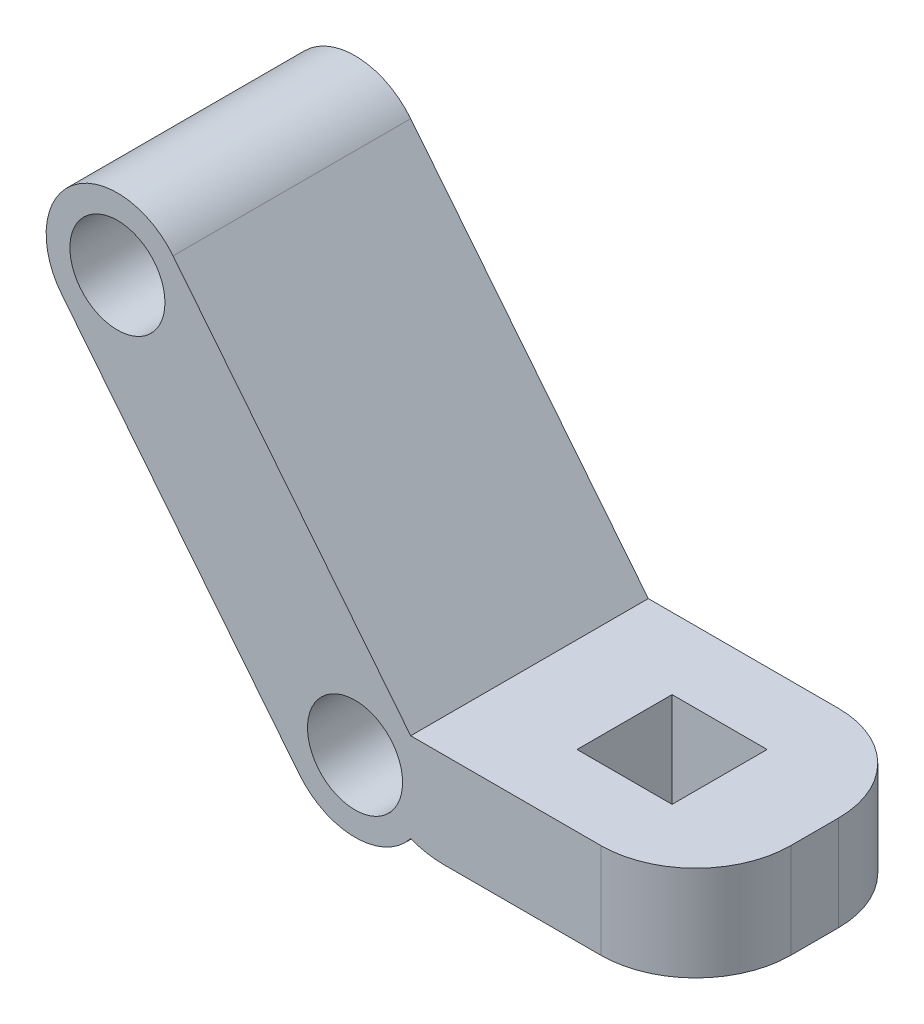
ISO-10303-21;
HEADER;
FILE_DESCRIPTION(('STEP AP214'),'2;1');
FILE_NAME('part.step','',(''),(''),'','','');
FILE_SCHEMA(('AUTOMOTIVE_DESIGN { 1 0 10303 214 1 1 1 1 }'));
ENDSEC;
DATA;
#1=APPLICATION_CONTEXT('core data for automotive mechanical design processes');
#2=APPLICATION_PROTOCOL_DEFINITION('international standard','automotive_design',2000,#1);
#3=PRODUCT_CONTEXT('',#1,'mechanical');
#4=PRODUCT('Part','Part','',(#3));
#5=PRODUCT_RELATED_PRODUCT_CATEGORY('part','',(#4));
#6=PRODUCT_DEFINITION_FORMATION('','',#4);
#7=PRODUCT_DEFINITION_CONTEXT('part definition',#1,'design');
#8=PRODUCT_DEFINITION('design','',#6,#7);
#9=PRODUCT_DEFINITION_SHAPE('','',#8);
#10=(LENGTH_UNIT() NAMED_UNIT(*) SI_UNIT(.MILLI.,.METRE.));
#11=(NAMED_UNIT(*) PLANE_ANGLE_UNIT() SI_UNIT($,.RADIAN.));
#12=(NAMED_UNIT(*) SI_UNIT($,.STERADIAN.) SOLID_ANGLE_UNIT());
#13=UNCERTAINTY_MEASURE_WITH_UNIT(LENGTH_MEASURE(1.E-05),#10,'distance_accuracy_value','');
#14=(GEOMETRIC_REPRESENTATION_CONTEXT(3) GLOBAL_UNCERTAINTY_ASSIGNED_CONTEXT((#13)) GLOBAL_UNIT_ASSIGNED_CONTEXT((#10,
#11,#12)) REPRESENTATION_CONTEXT('',''));
#15=CARTESIAN_POINT('',(0.,0.,0.));
#16=DIRECTION('',(0.,0.,1.));
#17=DIRECTION('',(1.,0.,0.));
#18=AXIS2_PLACEMENT_3D('',#15,#16,#17);
#19=CARTESIAN_POINT('',(-30.8546856234985,26.537489991992,25.));
#20=DIRECTION('',(0.,0.,-1.));
#21=DIRECTION('',(-1.,0.,0.));
#22=AXIS2_PLACEMENT_3D('',#19,#20,#21);
#23=CYLINDRICAL_SURFACE('',#22,7.49999999999999);
#24=CARTESIAN_POINT('',(-30.8546856234985,26.537489991992,0.));
#25=DIRECTION('',(0.,0.,1.));
#26=DIRECTION('',(1.,0.,0.));
#27=AXIS2_PLACEMENT_3D('',#24,#25,#26);
#28=CIRCLE('',#27,7.49999999999999);
#29=CARTESIAN_POINT('',(-25.,31.224989991992,0.));
#30=VERTEX_POINT('',#29);
#31=CARTESIAN_POINT('',(-36.709371246997,21.849989991992,0.));
#32=VERTEX_POINT('',#31);
#33=EDGE_CURVE('E224',#30,#32,#28,.T.);
#34=ORIENTED_EDGE('',*,*,#33,.T.);
#35=DIRECTION('',(0.,0.,-1.));
#36=VECTOR('',#35,1.);
#37=CARTESIAN_POINT('',(-36.709371246997,21.849989991992,25.));
#38=LINE('',#37,#36);
#39=CARTESIAN_POINT('',(-36.709371246997,21.849989991992,25.));
#40=VERTEX_POINT('',#39);
#41=EDGE_CURVE('E274',#40,#32,#38,.T.);
#42=ORIENTED_EDGE('',*,*,#41,.F.);
#43=CARTESIAN_POINT('',(-30.8546856234985,26.537489991992,25.));
#44=DIRECTION('',(0.,0.,1.));
#45=DIRECTION('',(1.,0.,0.));
#46=AXIS2_PLACEMENT_3D('',#43,#44,#45);
#47=CIRCLE('',#46,7.49999999999999);
#48=CARTESIAN_POINT('',(-25.,31.224989991992,25.));
#49=VERTEX_POINT('',#48);
#50=EDGE_CURVE('E236',#49,#40,#47,.T.);
#51=ORIENTED_EDGE('',*,*,#50,.F.);
#52=DIRECTION('',(0.,0.,-1.));
#53=VECTOR('',#52,1.);
#54=CARTESIAN_POINT('',(-25.,31.224989991992,25.));
#55=LINE('',#54,#53);
#56=EDGE_CURVE('E250',#49,#30,#55,.T.);
#57=ORIENTED_EDGE('',*,*,#56,.T.);
#58=EDGE_LOOP('',(#34,#42,#51,#57));
#59=FACE_BOUND('',#58,.T.);
#60=ADVANCED_FACE('F39',(#59),#23,.T.);
#61=CARTESIAN_POINT('',(-36.709371246997,21.849989991992,25.));
#62=DIRECTION('',(0.7806247497998,0.625,0.));
#63=DIRECTION('',(-0.625,0.7806247497998,0.));
#64=AXIS2_PLACEMENT_3D('',#61,#62,#63);
#65=PLANE('',#64);
#66=DIRECTION('',(0.625,-0.7806247497998,0.));
#67=VECTOR('',#66,1.);
#68=CARTESIAN_POINT('',(-36.709371246997,21.849989991992,0.));
#69=LINE('',#68,#67);
#70=CARTESIAN_POINT('',(-11.709371246997,-9.37499999999999,0.));
#71=VERTEX_POINT('',#70);
#72=EDGE_CURVE('E254',#32,#71,#69,.T.);
#73=ORIENTED_EDGE('',*,*,#72,.T.);
#74=DIRECTION('',(0.,0.,-1.));
#75=VECTOR('',#74,1.);
#76=CARTESIAN_POINT('',(-11.709371246997,-9.37499999999999,25.));
#77=LINE('',#76,#75);
#78=CARTESIAN_POINT('',(-11.709371246997,-9.37499999999999,25.));
#79=VERTEX_POINT('',#78);
#80=EDGE_CURVE('E270',#79,#71,#77,.T.);
#81=ORIENTED_EDGE('',*,*,#80,.F.);
#82=DIRECTION('',(0.625,-0.7806247497998,0.));
#83=VECTOR('',#82,1.);
#84=CARTESIAN_POINT('',(-36.709371246997,21.849989991992,25.));
#85=LINE('',#84,#83);
#86=EDGE_CURVE('E240',#40,#79,#85,.T.);
#87=ORIENTED_EDGE('',*,*,#86,.F.);
#88=ORIENTED_EDGE('',*,*,#41,.T.);
#89=EDGE_LOOP('',(#73,#81,#87,#88));
#90=FACE_BOUND('',#89,.T.);
#91=ADVANCED_FACE('F328',(#90),#65,.F.);
#92=CARTESIAN_POINT('',(-5.85468562349849,-4.68749999999999,25.));
#93=DIRECTION('',(0.,0.,-1.));
#94=DIRECTION('',(-1.,0.,0.));
#95=AXIS2_PLACEMENT_3D('',#92,#93,#94);
#96=CYLINDRICAL_SURFACE('',#95,7.49999999999999);
#97=CARTESIAN_POINT('',(-5.85468562349849,-4.68749999999999,0.));
#98=DIRECTION('',(0.,0.,1.));
#99=DIRECTION('',(1.,0.,0.));
#100=AXIS2_PLACEMENT_3D('',#97,#98,#99);
#101=CIRCLE('',#100,7.49999999999999);
#102=CARTESIAN_POINT('',(0.,-9.37499999999999,0.));
#103=VERTEX_POINT('',#102);
#104=EDGE_CURVE('E257',#71,#103,#101,.T.);
#105=ORIENTED_EDGE('',*,*,#104,.T.);
#106=DIRECTION('',(0.,0.,-1.));
#107=VECTOR('',#106,1.);
#108=CARTESIAN_POINT('',(0.,-9.37499999999999,25.));
#109=LINE('',#108,#107);
#110=CARTESIAN_POINT('',(0.,-9.37499999999999,25.));
#111=VERTEX_POINT('',#110);
#112=EDGE_CURVE('E206',#103,#111,#109,.F.);
#113=ORIENTED_EDGE('',*,*,#112,.T.);
#114=CARTESIAN_POINT('',(-5.85468562349849,-4.68749999999999,25.));
#115=DIRECTION('',(0.,0.,1.));
#116=DIRECTION('',(1.,0.,0.));
#117=AXIS2_PLACEMENT_3D('',#114,#115,#116);
#118=CIRCLE('',#117,7.49999999999999);
#119=EDGE_CURVE('E244',#79,#111,#118,.T.);
#120=ORIENTED_EDGE('',*,*,#119,.F.);
#121=ORIENTED_EDGE('',*,*,#80,.T.);
#122=EDGE_LOOP('',(#105,#113,#120,#121));
#123=FACE_BOUND('',#122,.T.);
#124=ADVANCED_FACE('F332',(#123),#96,.T.);
#125=CARTESIAN_POINT('',(-25.,31.224989991992,25.));
#126=DIRECTION('',(-0.7806247497998,-0.625,0.));
#127=DIRECTION('',(0.625,-0.7806247497998,0.));
#128=AXIS2_PLACEMENT_3D('',#125,#126,#127);
#129=PLANE('',#128);
#130=DIRECTION('',(-0.625,0.7806247497998,0.));
#131=VECTOR('',#130,1.);
#132=CARTESIAN_POINT('',(-25.,31.224989991992,0.));
#133=LINE('',#132,#131);
#134=CARTESIAN_POINT('',(0.,0.,0.));
#135=VERTEX_POINT('',#134);
#136=EDGE_CURVE('E241',#135,#30,#133,.T.);
#137=ORIENTED_EDGE('',*,*,#136,.T.);
#138=ORIENTED_EDGE('',*,*,#56,.F.);
#139=DIRECTION('',(-0.625,0.7806247497998,0.));
#140=VECTOR('',#139,1.);
#141=CARTESIAN_POINT('',(-25.,31.224989991992,25.));
#142=LINE('',#141,#140);
#143=CARTESIAN_POINT('',(0.,0.,25.));
#144=VERTEX_POINT('',#143);
#145=EDGE_CURVE('E247',#144,#49,#142,.T.);
#146=ORIENTED_EDGE('',*,*,#145,.F.);
#147=DIRECTION('',(0.,0.,-1.));
#148=VECTOR('',#147,1.);
#149=CARTESIAN_POINT('',(0.,0.,25.));
#150=LINE('',#149,#148);
#151=EDGE_CURVE('E266',#144,#135,#150,.T.);
#152=ORIENTED_EDGE('',*,*,#151,.T.);
#153=EDGE_LOOP('',(#137,#138,#146,#152));
#154=FACE_BOUND('',#153,.T.);
#155=ADVANCED_FACE('F321',(#154),#129,.F.);
#156=CARTESIAN_POINT('',(-30.8546856234985,26.537489991992,25.));
#157=DIRECTION('',(0.,0.,1.));
#158=DIRECTION('',(1.,0.,0.));
#159=AXIS2_PLACEMENT_3D('',#156,#157,#158);
#160=PLANE('',#159);
#161=ORIENTED_EDGE('',*,*,#119,.T.);
#162=CARTESIAN_POINT('',(3.4798527267688,0.,25.));
#163=DIRECTION('',(0.,0.,1.));
#164=DIRECTION('',(1.,0.,0.));
#165=AXIS2_PLACEMENT_3D('',#162,#163,#164);
#166=CIRCLE('',#165,10.);
#167=CARTESIAN_POINT('',(3.4798527267688,-10.,25.));
#168=VERTEX_POINT('',#167);
#169=EDGE_CURVE('E62',#111,#168,#166,.T.);
#170=ORIENTED_EDGE('',*,*,#169,.T.);
#171=DIRECTION('',(1.,0.,0.));
#172=VECTOR('',#171,1.);
#173=CARTESIAN_POINT('',(0.,-10.,25.));
#174=LINE('',#173,#172);
#175=CARTESIAN_POINT('',(20.,-10.,25.));
#176=VERTEX_POINT('',#175);
#177=EDGE_CURVE('E195',#168,#176,#174,.T.);
#178=ORIENTED_EDGE('',*,*,#177,.T.);
#179=DIRECTION('',(0.,1.,0.));
#180=VECTOR('',#179,1.);
#181=CARTESIAN_POINT('',(20.,26.537489991992,25.));
#182=LINE('',#181,#180);
#183=CARTESIAN_POINT('',(20.,0.,25.));
#184=VERTEX_POINT('',#183);
#185=EDGE_CURVE('E301',#176,#184,#182,.T.);
#186=ORIENTED_EDGE('',*,*,#185,.T.);
#187=DIRECTION('',(1.,0.,0.));
#188=VECTOR('',#187,1.);
#189=CARTESIAN_POINT('',(0.,0.,25.));
#190=LINE('',#189,#188);
#191=EDGE_CURVE('E189',#144,#184,#190,.T.);
#192=ORIENTED_EDGE('',*,*,#191,.F.);
#193=ORIENTED_EDGE('',*,*,#145,.T.);
#194=ORIENTED_EDGE('',*,*,#50,.T.);
#195=ORIENTED_EDGE('',*,*,#86,.T.);
#196=EDGE_LOOP('',(#161,#170,#178,#186,#192,#193,#194,#195));
#197=FACE_BOUND('',#196,.T.);
#198=CARTESIAN_POINT('',(-30.8546856234985,26.537489991992,25.));
#199=DIRECTION('',(0.,0.,1.));
#200=DIRECTION('',(1.,0.,0.));
#201=AXIS2_PLACEMENT_3D('',#198,#199,#200);
#202=CIRCLE('',#201,5.);
#203=CARTESIAN_POINT('',(-25.8546856234985,26.537489991992,25.));
#204=VERTEX_POINT('',#203);
#205=EDGE_CURVE('E225',#204,#204,#202,.T.);
#206=ORIENTED_EDGE('',*,*,#205,.F.);
#207=EDGE_LOOP('',(#206));
#208=FACE_BOUND('',#207,.T.);
#209=CARTESIAN_POINT('',(-5.85468562349849,-4.68749999999999,25.));
#210=DIRECTION('',(0.,0.,1.));
#211=DIRECTION('',(1.,0.,0.));
#212=AXIS2_PLACEMENT_3D('',#209,#210,#211);
#213=CIRCLE('',#212,5.);
#214=CARTESIAN_POINT('',(-0.854685623498492,-4.68749999999999,25.));
#215=VERTEX_POINT('',#214);
#216=EDGE_CURVE('E219',#215,#215,#213,.T.);
#217=ORIENTED_EDGE('',*,*,#216,.F.);
#218=EDGE_LOOP('',(#217));
#219=FACE_BOUND('',#218,.T.);
#220=ADVANCED_FACE('F308',(#197,#208,#219),#160,.T.);
#221=CARTESIAN_POINT('',(-30.8546856234985,26.537489991992,0.));
#222=DIRECTION('',(0.,0.,1.));
#223=DIRECTION('',(1.,0.,0.));
#224=AXIS2_PLACEMENT_3D('',#221,#222,#223);
#225=PLANE('',#224);
#226=CARTESIAN_POINT('',(-30.8546856234985,26.537489991992,0.));
#227=DIRECTION('',(0.,0.,1.));
#228=DIRECTION('',(1.,0.,0.));
#229=AXIS2_PLACEMENT_3D('',#226,#227,#228);
#230=CIRCLE('',#229,5.);
#231=CARTESIAN_POINT('',(-25.8546856234985,26.537489991992,0.));
#232=VERTEX_POINT('',#231);
#233=EDGE_CURVE('E220',#232,#232,#230,.T.);
#234=ORIENTED_EDGE('',*,*,#233,.T.);
#235=EDGE_LOOP('',(#234));
#236=FACE_BOUND('',#235,.T.);
#237=CARTESIAN_POINT('',(-5.85468562349849,-4.68749999999999,0.));
#238=DIRECTION('',(0.,0.,1.));
#239=DIRECTION('',(1.,0.,0.));
#240=AXIS2_PLACEMENT_3D('',#237,#238,#239);
#241=CIRCLE('',#240,5.);
#242=CARTESIAN_POINT('',(-0.854685623498492,-4.68749999999999,0.));
#243=VERTEX_POINT('',#242);
#244=EDGE_CURVE('E229',#243,#243,#241,.T.);
#245=ORIENTED_EDGE('',*,*,#244,.T.);
#246=EDGE_LOOP('',(#245));
#247=FACE_BOUND('',#246,.T.);
#248=DIRECTION('',(-1.,0.,0.));
#249=VECTOR('',#248,1.);
#250=CARTESIAN_POINT('',(0.,-10.,0.));
#251=LINE('',#250,#249);
#252=CARTESIAN_POINT('',(20.,-10.,0.));
#253=VERTEX_POINT('',#252);
#254=CARTESIAN_POINT('',(3.4798527267688,-10.,0.));
#255=VERTEX_POINT('',#254);
#256=EDGE_CURVE('E203',#253,#255,#251,.T.);
#257=ORIENTED_EDGE('',*,*,#256,.T.);
#258=CARTESIAN_POINT('',(3.4798527267688,0.,0.));
#259=DIRECTION('',(0.,0.,1.));
#260=DIRECTION('',(1.,0.,0.));
#261=AXIS2_PLACEMENT_3D('',#258,#259,#260);
#262=CIRCLE('',#261,10.);
#263=EDGE_CURVE('E11',#255,#103,#262,.F.);
#264=ORIENTED_EDGE('',*,*,#263,.T.);
#265=ORIENTED_EDGE('',*,*,#104,.F.);
#266=ORIENTED_EDGE('',*,*,#72,.F.);
#267=ORIENTED_EDGE('',*,*,#33,.F.);
#268=ORIENTED_EDGE('',*,*,#136,.F.);
#269=DIRECTION('',(-1.,0.,0.));
#270=VECTOR('',#269,1.);
#271=CARTESIAN_POINT('',(0.,0.,0.));
#272=LINE('',#271,#270);
#273=CARTESIAN_POINT('',(20.,0.,0.));
#274=VERTEX_POINT('',#273);
#275=EDGE_CURVE('E199',#274,#135,#272,.T.);
#276=ORIENTED_EDGE('',*,*,#275,.F.);
#277=DIRECTION('',(0.,1.,0.));
#278=VECTOR('',#277,1.);
#279=CARTESIAN_POINT('',(20.,-10.,0.));
#280=LINE('',#279,#278);
#281=EDGE_CURVE('E291',#274,#253,#280,.F.);
#282=ORIENTED_EDGE('',*,*,#281,.T.);
#283=EDGE_LOOP('',(#257,#264,#265,#266,#267,#268,#276,#282));
#284=FACE_BOUND('',#283,.T.);
#285=ADVANCED_FACE('F337',(#236,#247,#284),#225,.F.);
#286=CARTESIAN_POINT('',(-5.85468562349849,-4.68749999999999,0.));
#287=DIRECTION('',(0.,0.,1.));
#288=DIRECTION('',(1.,0.,0.));
#289=AXIS2_PLACEMENT_3D('',#286,#287,#288);
#290=CYLINDRICAL_SURFACE('',#289,5.);
#291=ORIENTED_EDGE('',*,*,#244,.F.);
#292=EDGE_LOOP('',(#291));
#293=FACE_BOUND('',#292,.T.);
#294=ORIENTED_EDGE('',*,*,#216,.T.);
#295=EDGE_LOOP('',(#294));
#296=FACE_BOUND('',#295,.T.);
#297=ADVANCED_FACE('F367',(#293,#296),#290,.F.);
#298=CARTESIAN_POINT('',(-30.8546856234985,26.537489991992,0.));
#299=DIRECTION('',(0.,0.,1.));
#300=DIRECTION('',(1.,0.,0.));
#301=AXIS2_PLACEMENT_3D('',#298,#299,#300);
#302=CYLINDRICAL_SURFACE('',#301,5.);
#303=ORIENTED_EDGE('',*,*,#233,.F.);
#304=EDGE_LOOP('',(#303));
#305=FACE_BOUND('',#304,.T.);
#306=ORIENTED_EDGE('',*,*,#205,.T.);
#307=EDGE_LOOP('',(#306));
#308=FACE_BOUND('',#307,.T.);
#309=ADVANCED_FACE('F373',(#305,#308),#302,.F.);
#310=CARTESIAN_POINT('',(30.,-10.,0.));
#311=DIRECTION('',(1.,0.,0.));
#312=DIRECTION('',(0.,0.,-1.));
#313=AXIS2_PLACEMENT_3D('',#310,#311,#312);
#314=PLANE('',#313);
#315=DIRECTION('',(0.,0.,-1.));
#316=VECTOR('',#315,1.);
#317=CARTESIAN_POINT('',(30.,-10.,0.));
#318=LINE('',#317,#316);
#319=CARTESIAN_POINT('',(30.,-10.,15.));
#320=VERTEX_POINT('',#319);
#321=CARTESIAN_POINT('',(30.,-10.,10.));
#322=VERTEX_POINT('',#321);
#323=EDGE_CURVE('E198',#320,#322,#318,.T.);
#324=ORIENTED_EDGE('',*,*,#323,.T.);
#325=DIRECTION('',(0.,1.,0.));
#326=VECTOR('',#325,1.);
#327=CARTESIAN_POINT('',(30.,0.,10.));
#328=LINE('',#327,#326);
#329=CARTESIAN_POINT('',(30.,0.,10.));
#330=VERTEX_POINT('',#329);
#331=EDGE_CURVE('E281',#322,#330,#328,.T.);
#332=ORIENTED_EDGE('',*,*,#331,.T.);
#333=DIRECTION('',(0.,0.,-1.));
#334=VECTOR('',#333,1.);
#335=CARTESIAN_POINT('',(30.,0.,0.));
#336=LINE('',#335,#334);
#337=CARTESIAN_POINT('',(30.,0.,15.));
#338=VERTEX_POINT('',#337);
#339=EDGE_CURVE('E210',#338,#330,#336,.T.);
#340=ORIENTED_EDGE('',*,*,#339,.F.);
#341=DIRECTION('',(0.,1.,0.));
#342=VECTOR('',#341,1.);
#343=CARTESIAN_POINT('',(30.,-10.,15.));
#344=LINE('',#343,#342);
#345=EDGE_CURVE('E278',#338,#320,#344,.F.);
#346=ORIENTED_EDGE('',*,*,#345,.T.);
#347=EDGE_LOOP('',(#324,#332,#340,#346));
#348=FACE_BOUND('',#347,.T.);
#349=ADVANCED_FACE('F345',(#348),#314,.T.);
#350=CARTESIAN_POINT('',(0.,-10.,0.));
#351=DIRECTION('',(0.,1.,0.));
#352=DIRECTION('',(0.,0.,1.));
#353=AXIS2_PLACEMENT_3D('',#350,#351,#352);
#354=PLANE('',#353);
#355=DIRECTION('',(1.,0.,0.));
#356=VECTOR('',#355,1.);
#357=CARTESIAN_POINT('',(10.,-10.,17.5));
#358=LINE('',#357,#356);
#359=CARTESIAN_POINT('',(10.,-10.,17.5));
#360=VERTEX_POINT('',#359);
#361=CARTESIAN_POINT('',(20.,-10.,17.5));
#362=VERTEX_POINT('',#361);
#363=EDGE_CURVE('E153',#360,#362,#358,.T.);
#364=ORIENTED_EDGE('',*,*,#363,.T.);
#365=DIRECTION('',(0.,0.,-1.));
#366=VECTOR('',#365,1.);
#367=CARTESIAN_POINT('',(20.,-10.,17.5));
#368=LINE('',#367,#366);
#369=CARTESIAN_POINT('',(20.,-10.,7.5));
#370=VERTEX_POINT('',#369);
#371=EDGE_CURVE('E144',#362,#370,#368,.T.);
#372=ORIENTED_EDGE('',*,*,#371,.T.);
#373=DIRECTION('',(-1.,0.,0.));
#374=VECTOR('',#373,1.);
#375=CARTESIAN_POINT('',(10.,-10.,7.5));
#376=LINE('',#375,#374);
#377=CARTESIAN_POINT('',(10.,-10.,7.5));
#378=VERTEX_POINT('',#377);
#379=EDGE_CURVE('E157',#370,#378,#376,.T.);
#380=ORIENTED_EDGE('',*,*,#379,.T.);
#381=DIRECTION('',(0.,0.,1.));
#382=VECTOR('',#381,1.);
#383=CARTESIAN_POINT('',(10.,-10.,17.5));
#384=LINE('',#383,#382);
#385=EDGE_CURVE('E162',#378,#360,#384,.T.);
#386=ORIENTED_EDGE('',*,*,#385,.T.);
#387=EDGE_LOOP('',(#364,#372,#380,#386));
#388=FACE_BOUND('',#387,.T.);
#389=ORIENTED_EDGE('',*,*,#177,.F.);
#390=DIRECTION('',(0.,0.,-1.));
#391=VECTOR('',#390,1.);
#392=CARTESIAN_POINT('',(3.4798527267688,-10.,0.));
#393=LINE('',#392,#391);
#394=EDGE_CURVE('E48',#168,#255,#393,.T.);
#395=ORIENTED_EDGE('',*,*,#394,.T.);
#396=ORIENTED_EDGE('',*,*,#256,.F.);
#397=CARTESIAN_POINT('',(20.,-10.,10.));
#398=DIRECTION('',(0.,1.,0.));
#399=DIRECTION('',(0.,0.,1.));
#400=AXIS2_PLACEMENT_3D('',#397,#398,#399);
#401=CIRCLE('',#400,10.);
#402=EDGE_CURVE('E298',#253,#322,#401,.F.);
#403=ORIENTED_EDGE('',*,*,#402,.T.);
#404=ORIENTED_EDGE('',*,*,#323,.F.);
#405=CARTESIAN_POINT('',(20.,-10.,15.));
#406=DIRECTION('',(0.,1.,0.));
#407=DIRECTION('',(0.,0.,1.));
#408=AXIS2_PLACEMENT_3D('',#405,#406,#407);
#409=CIRCLE('',#408,10.);
#410=EDGE_CURVE('E294',#320,#176,#409,.F.);
#411=ORIENTED_EDGE('',*,*,#410,.T.);
#412=EDGE_LOOP('',(#389,#395,#396,#403,#404,#411));
#413=FACE_BOUND('',#412,.T.);
#414=ADVANCED_FACE('F164',(#388,#413),#354,.F.);
#415=CARTESIAN_POINT('',(0.,0.,0.));
#416=DIRECTION('',(0.,1.,0.));
#417=DIRECTION('',(0.,0.,1.));
#418=AXIS2_PLACEMENT_3D('',#415,#416,#417);
#419=PLANE('',#418);
#420=DIRECTION('',(0.,0.,-1.));
#421=VECTOR('',#420,1.);
#422=CARTESIAN_POINT('',(20.,0.,17.5));
#423=LINE('',#422,#421);
#424=CARTESIAN_POINT('',(20.,0.,17.5));
#425=VERTEX_POINT('',#424);
#426=CARTESIAN_POINT('',(20.,0.,7.5));
#427=VERTEX_POINT('',#426);
#428=EDGE_CURVE('E147',#425,#427,#423,.T.);
#429=ORIENTED_EDGE('',*,*,#428,.F.);
#430=DIRECTION('',(1.,0.,0.));
#431=VECTOR('',#430,1.);
#432=CARTESIAN_POINT('',(10.,0.,17.5));
#433=LINE('',#432,#431);
#434=CARTESIAN_POINT('',(10.,0.,17.5));
#435=VERTEX_POINT('',#434);
#436=EDGE_CURVE('E167',#435,#425,#433,.T.);
#437=ORIENTED_EDGE('',*,*,#436,.F.);
#438=DIRECTION('',(0.,0.,1.));
#439=VECTOR('',#438,1.);
#440=CARTESIAN_POINT('',(10.,0.,17.5));
#441=LINE('',#440,#439);
#442=CARTESIAN_POINT('',(10.,0.,7.5));
#443=VERTEX_POINT('',#442);
#444=EDGE_CURVE('E171',#443,#435,#441,.T.);
#445=ORIENTED_EDGE('',*,*,#444,.F.);
#446=DIRECTION('',(-1.,0.,0.));
#447=VECTOR('',#446,1.);
#448=CARTESIAN_POINT('',(10.,0.,7.5));
#449=LINE('',#448,#447);
#450=EDGE_CURVE('E180',#427,#443,#449,.T.);
#451=ORIENTED_EDGE('',*,*,#450,.F.);
#452=EDGE_LOOP('',(#429,#437,#445,#451));
#453=FACE_BOUND('',#452,.T.);
#454=ORIENTED_EDGE('',*,*,#339,.T.);
#455=CARTESIAN_POINT('',(20.,0.,10.));
#456=DIRECTION('',(0.,1.,0.));
#457=DIRECTION('',(0.,0.,1.));
#458=AXIS2_PLACEMENT_3D('',#455,#456,#457);
#459=CIRCLE('',#458,10.);
#460=EDGE_CURVE('E288',#330,#274,#459,.T.);
#461=ORIENTED_EDGE('',*,*,#460,.T.);
#462=ORIENTED_EDGE('',*,*,#275,.T.);
#463=ORIENTED_EDGE('',*,*,#151,.F.);
#464=ORIENTED_EDGE('',*,*,#191,.T.);
#465=CARTESIAN_POINT('',(20.,0.,15.));
#466=DIRECTION('',(0.,1.,0.));
#467=DIRECTION('',(0.,0.,1.));
#468=AXIS2_PLACEMENT_3D('',#465,#466,#467);
#469=CIRCLE('',#468,10.);
#470=EDGE_CURVE('E285',#184,#338,#469,.T.);
#471=ORIENTED_EDGE('',*,*,#470,.T.);
#472=EDGE_LOOP('',(#454,#461,#462,#463,#464,#471));
#473=FACE_BOUND('',#472,.T.);
#474=ADVANCED_FACE('F314',(#453,#473),#419,.T.);
#475=CARTESIAN_POINT('',(20.,-10.,17.5));
#476=DIRECTION('',(1.,0.,0.));
#477=DIRECTION('',(0.,0.,-1.));
#478=AXIS2_PLACEMENT_3D('',#475,#476,#477);
#479=PLANE('',#478);
#480=ORIENTED_EDGE('',*,*,#428,.T.);
#481=DIRECTION('',(0.,1.,0.));
#482=VECTOR('',#481,1.);
#483=CARTESIAN_POINT('',(20.,-10.,7.5));
#484=LINE('',#483,#482);
#485=EDGE_CURVE('E140',#370,#427,#484,.T.);
#486=ORIENTED_EDGE('',*,*,#485,.F.);
#487=ORIENTED_EDGE('',*,*,#371,.F.);
#488=DIRECTION('',(0.,1.,0.));
#489=VECTOR('',#488,1.);
#490=CARTESIAN_POINT('',(20.,-10.,17.5));
#491=LINE('',#490,#489);
#492=EDGE_CURVE('E186',#362,#425,#491,.T.);
#493=ORIENTED_EDGE('',*,*,#492,.T.);
#494=EDGE_LOOP('',(#480,#486,#487,#493));
#495=FACE_BOUND('',#494,.T.);
#496=ADVANCED_FACE('F142',(#495),#479,.F.);
#497=CARTESIAN_POINT('',(10.,-10.,17.5));
#498=DIRECTION('',(0.,0.,1.));
#499=DIRECTION('',(1.,0.,0.));
#500=AXIS2_PLACEMENT_3D('',#497,#498,#499);
#501=PLANE('',#500);
#502=ORIENTED_EDGE('',*,*,#436,.T.);
#503=ORIENTED_EDGE('',*,*,#492,.F.);
#504=ORIENTED_EDGE('',*,*,#363,.F.);
#505=DIRECTION('',(0.,1.,0.));
#506=VECTOR('',#505,1.);
#507=CARTESIAN_POINT('',(10.,-10.,17.5));
#508=LINE('',#507,#506);
#509=EDGE_CURVE('E190',#360,#435,#508,.T.);
#510=ORIENTED_EDGE('',*,*,#509,.T.);
#511=EDGE_LOOP('',(#502,#503,#504,#510));
#512=FACE_BOUND('',#511,.T.);
#513=ADVANCED_FACE('F387',(#512),#501,.F.);
#514=CARTESIAN_POINT('',(10.,-10.,17.5));
#515=DIRECTION('',(-1.,0.,0.));
#516=DIRECTION('',(0.,0.,1.));
#517=AXIS2_PLACEMENT_3D('',#514,#515,#516);
#518=PLANE('',#517);
#519=ORIENTED_EDGE('',*,*,#444,.T.);
#520=ORIENTED_EDGE('',*,*,#509,.F.);
#521=ORIENTED_EDGE('',*,*,#385,.F.);
#522=DIRECTION('',(0.,1.,0.));
#523=VECTOR('',#522,1.);
#524=CARTESIAN_POINT('',(10.,-10.,7.5));
#525=LINE('',#524,#523);
#526=EDGE_CURVE('E152',#378,#443,#525,.T.);
#527=ORIENTED_EDGE('',*,*,#526,.T.);
#528=EDGE_LOOP('',(#519,#520,#521,#527));
#529=FACE_BOUND('',#528,.T.);
#530=ADVANCED_FACE('F390',(#529),#518,.F.);
#531=CARTESIAN_POINT('',(10.,-10.,7.5));
#532=DIRECTION('',(0.,0.,-1.));
#533=DIRECTION('',(-1.,0.,0.));
#534=AXIS2_PLACEMENT_3D('',#531,#532,#533);
#535=PLANE('',#534);
#536=ORIENTED_EDGE('',*,*,#450,.T.);
#537=ORIENTED_EDGE('',*,*,#526,.F.);
#538=ORIENTED_EDGE('',*,*,#379,.F.);
#539=ORIENTED_EDGE('',*,*,#485,.T.);
#540=EDGE_LOOP('',(#536,#537,#538,#539));
#541=FACE_BOUND('',#540,.T.);
#542=ADVANCED_FACE('F158',(#541),#535,.F.);
#543=CARTESIAN_POINT('',(20.,-10.,10.));
#544=DIRECTION('',(0.,-1.,0.));
#545=DIRECTION('',(0.,0.,-1.));
#546=AXIS2_PLACEMENT_3D('',#543,#544,#545);
#547=CYLINDRICAL_SURFACE('',#546,10.);
#548=ORIENTED_EDGE('',*,*,#402,.F.);
#549=ORIENTED_EDGE('',*,*,#281,.F.);
#550=ORIENTED_EDGE('',*,*,#460,.F.);
#551=ORIENTED_EDGE('',*,*,#331,.F.);
#552=EDGE_LOOP('',(#548,#549,#550,#551));
#553=FACE_BOUND('',#552,.T.);
#554=ADVANCED_FACE('F343',(#553),#547,.T.);
#555=CARTESIAN_POINT('',(20.,26.537489991992,15.));
#556=DIRECTION('',(0.,1.,0.));
#557=DIRECTION('',(0.,0.,1.));
#558=AXIS2_PLACEMENT_3D('',#555,#556,#557);
#559=CYLINDRICAL_SURFACE('',#558,10.);
#560=ORIENTED_EDGE('',*,*,#410,.F.);
#561=ORIENTED_EDGE('',*,*,#345,.F.);
#562=ORIENTED_EDGE('',*,*,#470,.F.);
#563=ORIENTED_EDGE('',*,*,#185,.F.);
#564=EDGE_LOOP('',(#560,#561,#562,#563));
#565=FACE_BOUND('',#564,.T.);
#566=ADVANCED_FACE('F347',(#565),#559,.T.);
#567=CARTESIAN_POINT('',(3.4798527267688,0.,25.));
#568=DIRECTION('',(0.,0.,-1.));
#569=DIRECTION('',(-1.,0.,0.));
#570=AXIS2_PLACEMENT_3D('',#567,#568,#569);
#571=CYLINDRICAL_SURFACE('',#570,10.);
#572=ORIENTED_EDGE('',*,*,#263,.F.);
#573=ORIENTED_EDGE('',*,*,#394,.F.);
#574=ORIENTED_EDGE('',*,*,#169,.F.);
#575=ORIENTED_EDGE('',*,*,#112,.F.);
#576=EDGE_LOOP('',(#572,#573,#574,#575));
#577=FACE_BOUND('',#576,.T.);
#578=ADVANCED_FACE('F41',(#577),#571,.T.);
#579=CLOSED_SHELL('',(#60,#91,#124,#155,#220,#285,#297,#309,#349,#414,#474,#496,#513,#530,#542,
#554,#566,#578));
#580=MANIFOLD_SOLID_BREP('B2',#579);
#581=ADVANCED_BREP_SHAPE_REPRESENTATION('',(#18,#580),#14);
#582=SHAPE_DEFINITION_REPRESENTATION(#9,#581);
ENDSEC;
END-ISO-10303-21;
